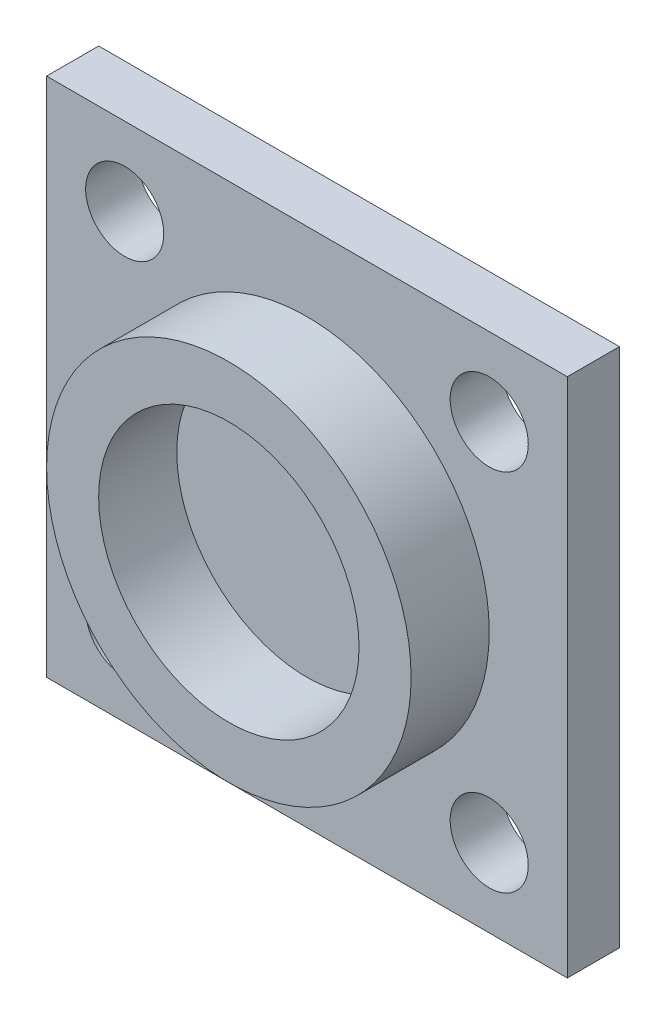
ISO-10303-21;
HEADER;
FILE_DESCRIPTION(('STEP AP214'),'2;1');
FILE_NAME('part.step','',(''),(''),'','','');
FILE_SCHEMA(('AUTOMOTIVE_DESIGN { 1 0 10303 214 1 1 1 1 }'));
ENDSEC;
DATA;
#1=APPLICATION_CONTEXT('core data for automotive mechanical design processes');
#2=APPLICATION_PROTOCOL_DEFINITION('international standard','automotive_design',2000,#1);
#3=PRODUCT_CONTEXT('',#1,'mechanical');
#4=PRODUCT('Part','Part','',(#3));
#5=PRODUCT_RELATED_PRODUCT_CATEGORY('part','',(#4));
#6=PRODUCT_DEFINITION_FORMATION('','',#4);
#7=PRODUCT_DEFINITION_CONTEXT('part definition',#1,'design');
#8=PRODUCT_DEFINITION('design','',#6,#7);
#9=PRODUCT_DEFINITION_SHAPE('','',#8);
#10=(LENGTH_UNIT() NAMED_UNIT(*) SI_UNIT(.MILLI.,.METRE.));
#11=(NAMED_UNIT(*) PLANE_ANGLE_UNIT() SI_UNIT($,.RADIAN.));
#12=(NAMED_UNIT(*) SI_UNIT($,.STERADIAN.) SOLID_ANGLE_UNIT());
#13=UNCERTAINTY_MEASURE_WITH_UNIT(LENGTH_MEASURE(1.E-05),#10,'distance_accuracy_value','');
#14=(GEOMETRIC_REPRESENTATION_CONTEXT(3) GLOBAL_UNCERTAINTY_ASSIGNED_CONTEXT((#13)) GLOBAL_UNIT_ASSIGNED_CONTEXT((#10,
#11,#12)) REPRESENTATION_CONTEXT('',''));
#15=CARTESIAN_POINT('',(0.,0.,0.));
#16=DIRECTION('',(0.,0.,1.));
#17=DIRECTION('',(1.,0.,0.));
#18=AXIS2_PLACEMENT_3D('',#15,#16,#17);
#19=CARTESIAN_POINT('',(0.,0.,2.));
#20=DIRECTION('',(0.,0.,1.));
#21=DIRECTION('',(1.,0.,0.));
#22=AXIS2_PLACEMENT_3D('',#19,#20,#21);
#23=PLANE('',#22);
#24=CARTESIAN_POINT('',(0.,0.,2.));
#25=DIRECTION('',(0.,0.,1.));
#26=DIRECTION('',(1.,0.,0.));
#27=AXIS2_PLACEMENT_3D('',#24,#25,#26);
#28=CIRCLE('',#27,7.);
#29=CARTESIAN_POINT('',(7.,0.,2.));
#30=VERTEX_POINT('',#29);
#31=EDGE_CURVE('E139',#30,#30,#28,.T.);
#32=ORIENTED_EDGE('',*,*,#31,.F.);
#33=EDGE_LOOP('',(#32));
#34=FACE_BOUND('',#33,.T.);
#35=CARTESIAN_POINT('',(7.00000000000039,-6.99999999999961,2.));
#36=DIRECTION('',(0.,0.,1.));
#37=DIRECTION('',(1.,0.,0.));
#38=AXIS2_PLACEMENT_3D('',#35,#36,#37);
#39=CIRCLE('',#38,1.50000000000055);
#40=CARTESIAN_POINT('',(8.50000000000094,-6.99999999999961,2.));
#41=VERTEX_POINT('',#40);
#42=EDGE_CURVE('E143',#41,#41,#39,.T.);
#43=ORIENTED_EDGE('',*,*,#42,.F.);
#44=EDGE_LOOP('',(#43));
#45=FACE_BOUND('',#44,.T.);
#46=CARTESIAN_POINT('',(-7.,7.,2.));
#47=DIRECTION('',(0.,0.,1.));
#48=DIRECTION('',(1.,0.,0.));
#49=AXIS2_PLACEMENT_3D('',#46,#47,#48);
#50=CIRCLE('',#49,1.5);
#51=CARTESIAN_POINT('',(-5.5,7.,2.));
#52=VERTEX_POINT('',#51);
#53=EDGE_CURVE('E105',#52,#52,#50,.T.);
#54=ORIENTED_EDGE('',*,*,#53,.F.);
#55=EDGE_LOOP('',(#54));
#56=FACE_BOUND('',#55,.T.);
#57=DIRECTION('',(0.,1.,0.));
#58=VECTOR('',#57,1.);
#59=CARTESIAN_POINT('',(10.,10.,2.));
#60=LINE('',#59,#58);
#61=CARTESIAN_POINT('',(10.,-10.,2.));
#62=VERTEX_POINT('',#61);
#63=CARTESIAN_POINT('',(10.,10.,2.));
#64=VERTEX_POINT('',#63);
#65=EDGE_CURVE('E88',#62,#64,#60,.T.);
#66=ORIENTED_EDGE('',*,*,#65,.T.);
#67=DIRECTION('',(-1.,0.,0.));
#68=VECTOR('',#67,1.);
#69=CARTESIAN_POINT('',(-10.,10.,2.));
#70=LINE('',#69,#68);
#71=CARTESIAN_POINT('',(-10.,10.,2.));
#72=VERTEX_POINT('',#71);
#73=EDGE_CURVE('E83',#64,#72,#70,.T.);
#74=ORIENTED_EDGE('',*,*,#73,.T.);
#75=DIRECTION('',(0.,-1.,0.));
#76=VECTOR('',#75,1.);
#77=CARTESIAN_POINT('',(-10.,10.,2.));
#78=LINE('',#77,#76);
#79=CARTESIAN_POINT('',(-10.,-10.,2.));
#80=VERTEX_POINT('',#79);
#81=EDGE_CURVE('E86',#72,#80,#78,.T.);
#82=ORIENTED_EDGE('',*,*,#81,.T.);
#83=DIRECTION('',(1.,0.,0.));
#84=VECTOR('',#83,1.);
#85=CARTESIAN_POINT('',(-10.,-10.,2.));
#86=LINE('',#85,#84);
#87=EDGE_CURVE('E52',#80,#62,#86,.T.);
#88=ORIENTED_EDGE('',*,*,#87,.T.);
#89=EDGE_LOOP('',(#66,#74,#82,#88));
#90=FACE_BOUND('',#89,.T.);
#91=CARTESIAN_POINT('',(7.,7.00000000000039,2.));
#92=DIRECTION('',(0.,0.,1.));
#93=DIRECTION('',(1.,0.,0.));
#94=AXIS2_PLACEMENT_3D('',#91,#92,#93);
#95=CIRCLE('',#94,1.5000000000004);
#96=CARTESIAN_POINT('',(8.5000000000004,7.00000000000039,2.));
#97=VERTEX_POINT('',#96);
#98=EDGE_CURVE('E147',#97,#97,#95,.T.);
#99=ORIENTED_EDGE('',*,*,#98,.F.);
#100=EDGE_LOOP('',(#99));
#101=FACE_BOUND('',#100,.T.);
#102=CARTESIAN_POINT('',(-6.99999999999961,-7.,2.));
#103=DIRECTION('',(0.,0.,1.));
#104=DIRECTION('',(1.,0.,0.));
#105=AXIS2_PLACEMENT_3D('',#102,#103,#104);
#106=CIRCLE('',#105,1.50000000000021);
#107=CARTESIAN_POINT('',(-5.4999999999994,-7.,2.));
#108=VERTEX_POINT('',#107);
#109=EDGE_CURVE('E133',#108,#108,#106,.T.);
#110=ORIENTED_EDGE('',*,*,#109,.F.);
#111=EDGE_LOOP('',(#110));
#112=FACE_BOUND('',#111,.T.);
#113=ADVANCED_FACE('F35',(#34,#45,#56,#90,#101,#112),#23,.T.);
#114=CARTESIAN_POINT('',(0.,0.,0.));
#115=DIRECTION('',(0.,0.,1.));
#116=DIRECTION('',(1.,0.,0.));
#117=AXIS2_PLACEMENT_3D('',#114,#115,#116);
#118=PLANE('',#117);
#119=DIRECTION('',(0.,1.,0.));
#120=VECTOR('',#119,1.);
#121=CARTESIAN_POINT('',(10.,10.,0.));
#122=LINE('',#121,#120);
#123=CARTESIAN_POINT('',(10.,-10.,0.));
#124=VERTEX_POINT('',#123);
#125=CARTESIAN_POINT('',(10.,10.,0.));
#126=VERTEX_POINT('',#125);
#127=EDGE_CURVE('E102',#124,#126,#122,.T.);
#128=ORIENTED_EDGE('',*,*,#127,.F.);
#129=DIRECTION('',(1.,0.,0.));
#130=VECTOR('',#129,1.);
#131=CARTESIAN_POINT('',(-10.,-10.,0.));
#132=LINE('',#131,#130);
#133=CARTESIAN_POINT('',(-10.,-10.,0.));
#134=VERTEX_POINT('',#133);
#135=EDGE_CURVE('E75',#134,#124,#132,.T.);
#136=ORIENTED_EDGE('',*,*,#135,.F.);
#137=DIRECTION('',(0.,-1.,0.));
#138=VECTOR('',#137,1.);
#139=CARTESIAN_POINT('',(-10.,10.,0.));
#140=LINE('',#139,#138);
#141=CARTESIAN_POINT('',(-10.,10.,0.));
#142=VERTEX_POINT('',#141);
#143=EDGE_CURVE('E69',#142,#134,#140,.T.);
#144=ORIENTED_EDGE('',*,*,#143,.F.);
#145=DIRECTION('',(-1.,0.,0.));
#146=VECTOR('',#145,1.);
#147=CARTESIAN_POINT('',(-10.,10.,0.));
#148=LINE('',#147,#146);
#149=EDGE_CURVE('E93',#126,#142,#148,.T.);
#150=ORIENTED_EDGE('',*,*,#149,.F.);
#151=EDGE_LOOP('',(#128,#136,#144,#150));
#152=FACE_BOUND('',#151,.T.);
#153=CARTESIAN_POINT('',(-7.,7.,0.));
#154=DIRECTION('',(0.,0.,1.));
#155=DIRECTION('',(1.,0.,0.));
#156=AXIS2_PLACEMENT_3D('',#153,#154,#155);
#157=CIRCLE('',#156,1.5);
#158=CARTESIAN_POINT('',(-5.5,7.,0.));
#159=VERTEX_POINT('',#158);
#160=EDGE_CURVE('E120',#159,#159,#157,.T.);
#161=ORIENTED_EDGE('',*,*,#160,.T.);
#162=EDGE_LOOP('',(#161));
#163=FACE_BOUND('',#162,.T.);
#164=CARTESIAN_POINT('',(7.,7.00000000000039,0.));
#165=DIRECTION('',(0.,0.,1.));
#166=DIRECTION('',(1.,0.,0.));
#167=AXIS2_PLACEMENT_3D('',#164,#165,#166);
#168=CIRCLE('',#167,1.5000000000004);
#169=CARTESIAN_POINT('',(8.5000000000004,7.00000000000039,0.));
#170=VERTEX_POINT('',#169);
#171=EDGE_CURVE('E124',#170,#170,#168,.T.);
#172=ORIENTED_EDGE('',*,*,#171,.T.);
#173=EDGE_LOOP('',(#172));
#174=FACE_BOUND('',#173,.T.);
#175=CARTESIAN_POINT('',(7.00000000000039,-6.99999999999961,0.));
#176=DIRECTION('',(0.,0.,1.));
#177=DIRECTION('',(1.,0.,0.));
#178=AXIS2_PLACEMENT_3D('',#175,#176,#177);
#179=CIRCLE('',#178,1.50000000000055);
#180=CARTESIAN_POINT('',(8.50000000000094,-6.99999999999961,0.));
#181=VERTEX_POINT('',#180);
#182=EDGE_CURVE('E128',#181,#181,#179,.T.);
#183=ORIENTED_EDGE('',*,*,#182,.T.);
#184=EDGE_LOOP('',(#183));
#185=FACE_BOUND('',#184,.T.);
#186=CARTESIAN_POINT('',(-6.99999999999961,-7.,0.));
#187=DIRECTION('',(0.,0.,1.));
#188=DIRECTION('',(1.,0.,0.));
#189=AXIS2_PLACEMENT_3D('',#186,#187,#188);
#190=CIRCLE('',#189,1.50000000000021);
#191=CARTESIAN_POINT('',(-5.4999999999994,-7.,0.));
#192=VERTEX_POINT('',#191);
#193=EDGE_CURVE('E131',#192,#192,#190,.T.);
#194=ORIENTED_EDGE('',*,*,#193,.T.);
#195=EDGE_LOOP('',(#194));
#196=FACE_BOUND('',#195,.T.);
#197=ADVANCED_FACE('F113',(#152,#163,#174,#185,#196),#118,.F.);
#198=CARTESIAN_POINT('',(10.,10.,2.));
#199=DIRECTION('',(-1.,0.,0.));
#200=DIRECTION('',(0.,-1.,0.));
#201=AXIS2_PLACEMENT_3D('',#198,#199,#200);
#202=PLANE('',#201);
#203=ORIENTED_EDGE('',*,*,#127,.T.);
#204=DIRECTION('',(0.,0.,-1.));
#205=VECTOR('',#204,1.);
#206=CARTESIAN_POINT('',(10.,10.,2.));
#207=LINE('',#206,#205);
#208=EDGE_CURVE('E44',#64,#126,#207,.T.);
#209=ORIENTED_EDGE('',*,*,#208,.F.);
#210=ORIENTED_EDGE('',*,*,#65,.F.);
#211=DIRECTION('',(0.,0.,-1.));
#212=VECTOR('',#211,1.);
#213=CARTESIAN_POINT('',(10.,-10.,2.));
#214=LINE('',#213,#212);
#215=EDGE_CURVE('E98',#62,#124,#214,.T.);
#216=ORIENTED_EDGE('',*,*,#215,.T.);
#217=EDGE_LOOP('',(#203,#209,#210,#216));
#218=FACE_BOUND('',#217,.T.);
#219=ADVANCED_FACE('F37',(#218),#202,.F.);
#220=CARTESIAN_POINT('',(-10.,10.,2.));
#221=DIRECTION('',(0.,-1.,0.));
#222=DIRECTION('',(0.,0.,-1.));
#223=AXIS2_PLACEMENT_3D('',#220,#221,#222);
#224=PLANE('',#223);
#225=ORIENTED_EDGE('',*,*,#149,.T.);
#226=DIRECTION('',(0.,0.,-1.));
#227=VECTOR('',#226,1.);
#228=CARTESIAN_POINT('',(-10.,10.,2.));
#229=LINE('',#228,#227);
#230=EDGE_CURVE('E91',#72,#142,#229,.T.);
#231=ORIENTED_EDGE('',*,*,#230,.F.);
#232=ORIENTED_EDGE('',*,*,#73,.F.);
#233=ORIENTED_EDGE('',*,*,#208,.T.);
#234=EDGE_LOOP('',(#225,#231,#232,#233));
#235=FACE_BOUND('',#234,.T.);
#236=ADVANCED_FACE('F92',(#235),#224,.F.);
#237=CARTESIAN_POINT('',(-10.,10.,2.));
#238=DIRECTION('',(1.,0.,0.));
#239=DIRECTION('',(0.,1.,0.));
#240=AXIS2_PLACEMENT_3D('',#237,#238,#239);
#241=PLANE('',#240);
#242=ORIENTED_EDGE('',*,*,#143,.T.);
#243=DIRECTION('',(0.,0.,-1.));
#244=VECTOR('',#243,1.);
#245=CARTESIAN_POINT('',(-10.,-10.,2.));
#246=LINE('',#245,#244);
#247=EDGE_CURVE('E94',#80,#134,#246,.T.);
#248=ORIENTED_EDGE('',*,*,#247,.F.);
#249=ORIENTED_EDGE('',*,*,#81,.F.);
#250=ORIENTED_EDGE('',*,*,#230,.T.);
#251=EDGE_LOOP('',(#242,#248,#249,#250));
#252=FACE_BOUND('',#251,.T.);
#253=ADVANCED_FACE('F96',(#252),#241,.F.);
#254=CARTESIAN_POINT('',(-10.,-10.,2.));
#255=DIRECTION('',(0.,1.,0.));
#256=DIRECTION('',(0.,0.,1.));
#257=AXIS2_PLACEMENT_3D('',#254,#255,#256);
#258=PLANE('',#257);
#259=ORIENTED_EDGE('',*,*,#135,.T.);
#260=ORIENTED_EDGE('',*,*,#215,.F.);
#261=ORIENTED_EDGE('',*,*,#87,.F.);
#262=ORIENTED_EDGE('',*,*,#247,.T.);
#263=EDGE_LOOP('',(#259,#260,#261,#262));
#264=FACE_BOUND('',#263,.T.);
#265=ADVANCED_FACE('F201',(#264),#258,.F.);
#266=CARTESIAN_POINT('',(-7.,7.,2.));
#267=DIRECTION('',(0.,0.,-1.));
#268=DIRECTION('',(-1.,0.,0.));
#269=AXIS2_PLACEMENT_3D('',#266,#267,#268);
#270=CYLINDRICAL_SURFACE('',#269,1.5);
#271=ORIENTED_EDGE('',*,*,#53,.T.);
#272=EDGE_LOOP('',(#271));
#273=FACE_BOUND('',#272,.T.);
#274=ORIENTED_EDGE('',*,*,#160,.F.);
#275=EDGE_LOOP('',(#274));
#276=FACE_BOUND('',#275,.T.);
#277=ADVANCED_FACE('F155',(#273,#276),#270,.F.);
#278=CARTESIAN_POINT('',(7.,7.00000000000039,2.));
#279=DIRECTION('',(0.,0.,-1.));
#280=DIRECTION('',(-1.,0.,0.));
#281=AXIS2_PLACEMENT_3D('',#278,#279,#280);
#282=CYLINDRICAL_SURFACE('',#281,1.5000000000004);
#283=ORIENTED_EDGE('',*,*,#98,.T.);
#284=EDGE_LOOP('',(#283));
#285=FACE_BOUND('',#284,.T.);
#286=ORIENTED_EDGE('',*,*,#171,.F.);
#287=EDGE_LOOP('',(#286));
#288=FACE_BOUND('',#287,.T.);
#289=ADVANCED_FACE('F196',(#285,#288),#282,.F.);
#290=CARTESIAN_POINT('',(7.00000000000039,-6.99999999999961,2.));
#291=DIRECTION('',(0.,0.,-1.));
#292=DIRECTION('',(-1.,0.,0.));
#293=AXIS2_PLACEMENT_3D('',#290,#291,#292);
#294=CYLINDRICAL_SURFACE('',#293,1.50000000000055);
#295=ORIENTED_EDGE('',*,*,#42,.T.);
#296=EDGE_LOOP('',(#295));
#297=FACE_BOUND('',#296,.T.);
#298=ORIENTED_EDGE('',*,*,#182,.F.);
#299=EDGE_LOOP('',(#298));
#300=FACE_BOUND('',#299,.T.);
#301=ADVANCED_FACE('F192',(#297,#300),#294,.F.);
#302=CARTESIAN_POINT('',(-6.99999999999961,-7.,2.));
#303=DIRECTION('',(0.,0.,-1.));
#304=DIRECTION('',(-1.,0.,0.));
#305=AXIS2_PLACEMENT_3D('',#302,#303,#304);
#306=CYLINDRICAL_SURFACE('',#305,1.50000000000021);
#307=ORIENTED_EDGE('',*,*,#109,.T.);
#308=EDGE_LOOP('',(#307));
#309=FACE_BOUND('',#308,.T.);
#310=ORIENTED_EDGE('',*,*,#193,.F.);
#311=EDGE_LOOP('',(#310));
#312=FACE_BOUND('',#311,.T.);
#313=ADVANCED_FACE('F187',(#309,#312),#306,.F.);
#314=CARTESIAN_POINT('',(0.,0.,5.));
#315=DIRECTION('',(0.,0.,1.));
#316=DIRECTION('',(1.,0.,0.));
#317=AXIS2_PLACEMENT_3D('',#314,#315,#316);
#318=PLANE('',#317);
#319=CARTESIAN_POINT('',(0.,0.,5.));
#320=DIRECTION('',(0.,0.,1.));
#321=DIRECTION('',(1.,0.,0.));
#322=AXIS2_PLACEMENT_3D('',#319,#320,#321);
#323=CIRCLE('',#322,7.);
#324=CARTESIAN_POINT('',(7.,0.,5.));
#325=VERTEX_POINT('',#324);
#326=EDGE_CURVE('E134',#325,#325,#323,.T.);
#327=ORIENTED_EDGE('',*,*,#326,.T.);
#328=EDGE_LOOP('',(#327));
#329=FACE_BOUND('',#328,.T.);
#330=CARTESIAN_POINT('',(0.,0.,5.));
#331=DIRECTION('',(0.,0.,1.));
#332=DIRECTION('',(1.,0.,0.));
#333=AXIS2_PLACEMENT_3D('',#330,#331,#332);
#334=CIRCLE('',#333,5.);
#335=CARTESIAN_POINT('',(5.,0.,5.));
#336=VERTEX_POINT('',#335);
#337=EDGE_CURVE('E295',#336,#336,#334,.T.);
#338=ORIENTED_EDGE('',*,*,#337,.F.);
#339=EDGE_LOOP('',(#338));
#340=FACE_BOUND('',#339,.T.);
#341=ADVANCED_FACE('F181',(#329,#340),#318,.T.);
#342=CARTESIAN_POINT('',(0.,0.,5.));
#343=DIRECTION('',(0.,0.,-1.));
#344=DIRECTION('',(-1.,0.,0.));
#345=AXIS2_PLACEMENT_3D('',#342,#343,#344);
#346=CYLINDRICAL_SURFACE('',#345,7.);
#347=ORIENTED_EDGE('',*,*,#326,.F.);
#348=EDGE_LOOP('',(#347));
#349=FACE_BOUND('',#348,.T.);
#350=ORIENTED_EDGE('',*,*,#31,.T.);
#351=EDGE_LOOP('',(#350));
#352=FACE_BOUND('',#351,.T.);
#353=ADVANCED_FACE('F173',(#349,#352),#346,.T.);
#354=CARTESIAN_POINT('',(0.,0.,5.));
#355=DIRECTION('',(0.,0.,-1.));
#356=DIRECTION('',(-1.,0.,0.));
#357=AXIS2_PLACEMENT_3D('',#354,#355,#356);
#358=CYLINDRICAL_SURFACE('',#357,5.);
#359=ORIENTED_EDGE('',*,*,#337,.T.);
#360=EDGE_LOOP('',(#359));
#361=FACE_BOUND('',#360,.T.);
#362=CARTESIAN_POINT('',(0.,0.,2.));
#363=DIRECTION('',(0.,0.,1.));
#364=DIRECTION('',(1.,0.,0.));
#365=AXIS2_PLACEMENT_3D('',#362,#363,#364);
#366=CIRCLE('',#365,5.);
#367=CARTESIAN_POINT('',(5.,0.,2.));
#368=VERTEX_POINT('',#367);
#369=EDGE_CURVE('E11',#368,#368,#366,.F.);
#370=ORIENTED_EDGE('',*,*,#369,.T.);
#371=EDGE_LOOP('',(#370));
#372=FACE_BOUND('',#371,.T.);
#373=ADVANCED_FACE('F168',(#361,#372),#358,.F.);
#374=ORIENTED_EDGE('',*,*,#369,.F.);
#375=EDGE_LOOP('',(#374));
#376=FACE_BOUND('',#375,.T.);
#377=ADVANCED_FACE('F161',(#376),#23,.T.);
#378=CLOSED_SHELL('',(#113,#197,#219,#236,#253,#265,#277,#289,#301,#313,#341,#353,#373,#377));
#379=MANIFOLD_SOLID_BREP('B2',#378);
#380=ADVANCED_BREP_SHAPE_REPRESENTATION('',(#18,#379),#14);
#381=SHAPE_DEFINITION_REPRESENTATION(#9,#380);
ENDSEC;
END-ISO-10303-21;
